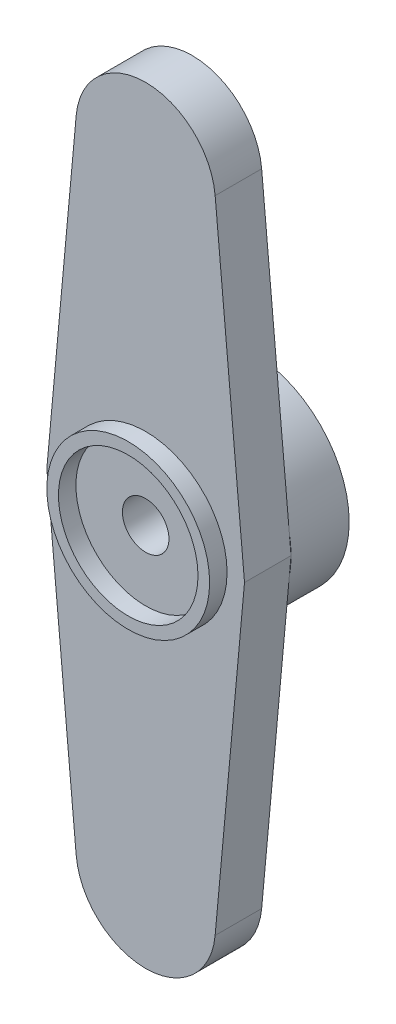
ISO-10303-21;
HEADER;
FILE_DESCRIPTION(('STEP AP214'),'2;1');
FILE_NAME('part.step','',(''),(''),'','','');
FILE_SCHEMA(('AUTOMOTIVE_DESIGN { 1 0 10303 214 1 1 1 1 }'));
ENDSEC;
DATA;
#1=APPLICATION_CONTEXT('core data for automotive mechanical design processes');
#2=APPLICATION_PROTOCOL_DEFINITION('international standard','automotive_design',2000,#1);
#3=PRODUCT_CONTEXT('',#1,'mechanical');
#4=PRODUCT('Part','Part','',(#3));
#5=PRODUCT_RELATED_PRODUCT_CATEGORY('part','',(#4));
#6=PRODUCT_DEFINITION_FORMATION('','',#4);
#7=PRODUCT_DEFINITION_CONTEXT('part definition',#1,'design');
#8=PRODUCT_DEFINITION('design','',#6,#7);
#9=PRODUCT_DEFINITION_SHAPE('','',#8);
#10=(LENGTH_UNIT() NAMED_UNIT(*) SI_UNIT(.MILLI.,.METRE.));
#11=(NAMED_UNIT(*) PLANE_ANGLE_UNIT() SI_UNIT($,.RADIAN.));
#12=(NAMED_UNIT(*) SI_UNIT($,.STERADIAN.) SOLID_ANGLE_UNIT());
#13=UNCERTAINTY_MEASURE_WITH_UNIT(LENGTH_MEASURE(1.E-05),#10,'distance_accuracy_value','');
#14=(GEOMETRIC_REPRESENTATION_CONTEXT(3) GLOBAL_UNCERTAINTY_ASSIGNED_CONTEXT((#13)) GLOBAL_UNIT_ASSIGNED_CONTEXT((#10,
#11,#12)) REPRESENTATION_CONTEXT('',''));
#15=CARTESIAN_POINT('',(0.,0.,0.));
#16=DIRECTION('',(0.,0.,1.));
#17=DIRECTION('',(1.,0.,0.));
#18=AXIS2_PLACEMENT_3D('',#15,#16,#17);
#19=CARTESIAN_POINT('',(0.,-13.5,4.5));
#20=DIRECTION('',(0.,0.,1.));
#21=DIRECTION('',(1.,0.,0.));
#22=AXIS2_PLACEMENT_3D('',#19,#20,#21);
#23=PLANE('',#22);
#24=CARTESIAN_POINT('',(0.,0.,4.5));
#25=DIRECTION('',(0.,0.,1.));
#26=DIRECTION('',(1.,0.,0.));
#27=AXIS2_PLACEMENT_3D('',#24,#25,#26);
#28=CIRCLE('',#27,1.);
#29=CARTESIAN_POINT('',(1.,0.,4.5));
#30=VERTEX_POINT('',#29);
#31=EDGE_CURVE('E228',#30,#30,#28,.T.);
#32=ORIENTED_EDGE('',*,*,#31,.F.);
#33=EDGE_LOOP('',(#32));
#34=FACE_BOUND('',#33,.T.);
#35=CARTESIAN_POINT('',(0.,0.,4.5));
#36=DIRECTION('',(0.,0.,1.));
#37=DIRECTION('',(1.,0.,0.));
#38=AXIS2_PLACEMENT_3D('',#35,#36,#37);
#39=CIRCLE('',#38,3.);
#40=CARTESIAN_POINT('',(3.,0.,4.5));
#41=VERTEX_POINT('',#40);
#42=EDGE_CURVE('E425',#41,#41,#39,.T.);
#43=ORIENTED_EDGE('',*,*,#42,.T.);
#44=EDGE_LOOP('',(#43));
#45=FACE_BOUND('',#44,.T.);
#46=ADVANCED_FACE('F39',(#34,#45),#23,.T.);
#47=CARTESIAN_POINT('',(0.,0.,2.5));
#48=DIRECTION('',(0.,0.,1.));
#49=DIRECTION('',(1.,0.,0.));
#50=AXIS2_PLACEMENT_3D('',#47,#48,#49);
#51=PLANE('',#50);
#52=DIRECTION('',(0.0912783716587728,-0.995825415857279,0.));
#53=VECTOR('',#52,1.);
#54=CARTESIAN_POINT('',(-4.25,0.,2.5));
#55=LINE('',#54,#53);
#56=CARTESIAN_POINT('',(-4.25,0.,2.5));
#57=VERTEX_POINT('',#56);
#58=CARTESIAN_POINT('',(-4.17918020037224,-0.772627240534918,2.5));
#59=VERTEX_POINT('',#58);
#60=EDGE_CURVE('E246',#57,#59,#55,.T.);
#61=ORIENTED_EDGE('',*,*,#60,.F.);
#62=CARTESIAN_POINT('',(0.,0.,2.5));
#63=DIRECTION('',(0.,0.,1.));
#64=DIRECTION('',(1.,0.,0.));
#65=AXIS2_PLACEMENT_3D('',#62,#63,#64);
#66=CIRCLE('',#65,4.25);
#67=EDGE_CURVE('E154',#57,#59,#66,.T.);
#68=ORIENTED_EDGE('',*,*,#67,.T.);
#69=EDGE_LOOP('',(#61,#68));
#70=FACE_BOUND('',#69,.T.);
#71=ADVANCED_FACE('F181',(#70),#51,.T.);
#72=DIRECTION('',(-0.0912783716587731,-0.995825415857279,0.));
#73=VECTOR('',#72,1.);
#74=CARTESIAN_POINT('',(-4.25,0.,2.5));
#75=LINE('',#74,#73);
#76=CARTESIAN_POINT('',(-4.17918020037224,0.772627240534919,2.5));
#77=VERTEX_POINT('',#76);
#78=EDGE_CURVE('E48',#77,#57,#75,.T.);
#79=ORIENTED_EDGE('',*,*,#78,.F.);
#80=EDGE_CURVE('E152',#77,#57,#66,.T.);
#81=ORIENTED_EDGE('',*,*,#80,.T.);
#82=EDGE_LOOP('',(#79,#81));
#83=FACE_BOUND('',#82,.T.);
#84=ADVANCED_FACE('F188',(#83),#51,.T.);
#85=DIRECTION('',(-0.0912783716587731,0.995825415857279,0.));
#86=VECTOR('',#85,1.);
#87=CARTESIAN_POINT('',(2.98747624757184,13.7738351149763,2.5));
#88=LINE('',#87,#86);
#89=CARTESIAN_POINT('',(4.25,0.,2.5));
#90=VERTEX_POINT('',#89);
#91=CARTESIAN_POINT('',(4.17918020037224,0.772627240534919,2.5));
#92=VERTEX_POINT('',#91);
#93=EDGE_CURVE('E254',#90,#92,#88,.T.);
#94=ORIENTED_EDGE('',*,*,#93,.F.);
#95=EDGE_CURVE('E145',#90,#92,#66,.T.);
#96=ORIENTED_EDGE('',*,*,#95,.T.);
#97=EDGE_LOOP('',(#94,#96));
#98=FACE_BOUND('',#97,.T.);
#99=ADVANCED_FACE('F387',(#98),#51,.T.);
#100=DIRECTION('',(0.0912783716587728,0.995825415857279,0.));
#101=VECTOR('',#100,1.);
#102=CARTESIAN_POINT('',(2.98747624757184,-13.7738351149763,2.5));
#103=LINE('',#102,#101);
#104=CARTESIAN_POINT('',(4.17918020037224,-0.772627240534918,2.5));
#105=VERTEX_POINT('',#104);
#106=EDGE_CURVE('E54',#105,#90,#103,.T.);
#107=ORIENTED_EDGE('',*,*,#106,.F.);
#108=EDGE_CURVE('E150',#105,#90,#66,.T.);
#109=ORIENTED_EDGE('',*,*,#108,.T.);
#110=EDGE_LOOP('',(#107,#109));
#111=FACE_BOUND('',#110,.T.);
#112=ADVANCED_FACE('F162',(#111),#51,.T.);
#113=CARTESIAN_POINT('',(0.,0.,0.));
#114=DIRECTION('',(0.,0.,1.));
#115=DIRECTION('',(1.,0.,0.));
#116=AXIS2_PLACEMENT_3D('',#113,#114,#115);
#117=PLANE('',#116);
#118=CARTESIAN_POINT('',(0.,0.,0.));
#119=DIRECTION('',(0.,0.,1.));
#120=DIRECTION('',(1.,0.,0.));
#121=AXIS2_PLACEMENT_3D('',#118,#119,#120);
#122=CIRCLE('',#121,4.25);
#123=CARTESIAN_POINT('',(4.25,0.,0.));
#124=VERTEX_POINT('',#123);
#125=EDGE_CURVE('E43',#124,#124,#122,.T.);
#126=ORIENTED_EDGE('',*,*,#125,.F.);
#127=EDGE_LOOP('',(#126));
#128=FACE_BOUND('',#127,.T.);
#129=CARTESIAN_POINT('',(0.,0.,0.));
#130=DIRECTION('',(0.,0.,1.));
#131=DIRECTION('',(1.,0.,0.));
#132=AXIS2_PLACEMENT_3D('',#129,#130,#131);
#133=CIRCLE('',#132,2.5);
#134=CARTESIAN_POINT('',(2.5,0.,0.));
#135=VERTEX_POINT('',#134);
#136=EDGE_CURVE('E139',#135,#135,#133,.T.);
#137=ORIENTED_EDGE('',*,*,#136,.T.);
#138=EDGE_LOOP('',(#137));
#139=FACE_BOUND('',#138,.T.);
#140=ADVANCED_FACE('F159',(#128,#139),#117,.F.);
#141=CARTESIAN_POINT('',(0.,0.,2.5));
#142=DIRECTION('',(0.,0.,-1.));
#143=DIRECTION('',(-1.,0.,0.));
#144=AXIS2_PLACEMENT_3D('',#141,#142,#143);
#145=CYLINDRICAL_SURFACE('',#144,4.25);
#146=ORIENTED_EDGE('',*,*,#95,.F.);
#147=ORIENTED_EDGE('',*,*,#108,.F.);
#148=EDGE_CURVE('E65',#59,#105,#66,.T.);
#149=ORIENTED_EDGE('',*,*,#148,.F.);
#150=ORIENTED_EDGE('',*,*,#67,.F.);
#151=ORIENTED_EDGE('',*,*,#80,.F.);
#152=EDGE_CURVE('E148',#92,#77,#66,.T.);
#153=ORIENTED_EDGE('',*,*,#152,.F.);
#154=EDGE_LOOP('',(#146,#147,#149,#150,#151,#153));
#155=FACE_BOUND('',#154,.T.);
#156=ORIENTED_EDGE('',*,*,#125,.T.);
#157=EDGE_LOOP('',(#156));
#158=FACE_BOUND('',#157,.T.);
#159=ADVANCED_FACE('F41',(#155,#158),#145,.T.);
#160=CARTESIAN_POINT('',(0.,0.,2.5));
#161=DIRECTION('',(0.,0.,-1.));
#162=DIRECTION('',(-1.,0.,0.));
#163=AXIS2_PLACEMENT_3D('',#160,#161,#162);
#164=CYLINDRICAL_SURFACE('',#163,2.5);
#165=CARTESIAN_POINT('',(0.,0.,2.5));
#166=DIRECTION('',(0.,0.,1.));
#167=DIRECTION('',(1.,0.,0.));
#168=AXIS2_PLACEMENT_3D('',#165,#166,#167);
#169=CIRCLE('',#168,2.5);
#170=CARTESIAN_POINT('',(2.5,0.,2.5));
#171=VERTEX_POINT('',#170);
#172=EDGE_CURVE('E131',#171,#171,#169,.T.);
#173=ORIENTED_EDGE('',*,*,#172,.T.);
#174=EDGE_LOOP('',(#173));
#175=FACE_BOUND('',#174,.T.);
#176=ORIENTED_EDGE('',*,*,#136,.F.);
#177=EDGE_LOOP('',(#176));
#178=FACE_BOUND('',#177,.T.);
#179=ADVANCED_FACE('F167',(#175,#178),#164,.F.);
#180=CARTESIAN_POINT('',(0.,-13.5,2.5));
#181=DIRECTION('',(0.,0.,1.));
#182=DIRECTION('',(1.,0.,0.));
#183=AXIS2_PLACEMENT_3D('',#180,#181,#182);
#184=PLANE('',#183);
#185=CARTESIAN_POINT('',(2.98747624757184,13.7738351149763,2.5));
#186=VERTEX_POINT('',#185);
#187=EDGE_CURVE('E255',#92,#186,#88,.T.);
#188=ORIENTED_EDGE('',*,*,#187,.F.);
#189=ORIENTED_EDGE('',*,*,#152,.T.);
#190=CARTESIAN_POINT('',(-2.98747624757184,13.7738351149763,2.5));
#191=VERTEX_POINT('',#190);
#192=EDGE_CURVE('E130',#191,#77,#75,.T.);
#193=ORIENTED_EDGE('',*,*,#192,.F.);
#194=CARTESIAN_POINT('',(0.,13.5,2.5));
#195=DIRECTION('',(0.,0.,1.));
#196=DIRECTION('',(-1.,0.,0.));
#197=AXIS2_PLACEMENT_3D('',#194,#195,#196);
#198=CIRCLE('',#197,3.);
#199=EDGE_CURVE('E256',#186,#191,#198,.T.);
#200=ORIENTED_EDGE('',*,*,#199,.F.);
#201=EDGE_LOOP('',(#188,#189,#193,#200));
#202=FACE_BOUND('',#201,.T.);
#203=ADVANCED_FACE('F169',(#202),#184,.F.);
#204=CARTESIAN_POINT('',(-2.98747624757184,-13.7738351149763,2.5));
#205=VERTEX_POINT('',#204);
#206=EDGE_CURVE('E135',#59,#205,#55,.T.);
#207=ORIENTED_EDGE('',*,*,#206,.F.);
#208=ORIENTED_EDGE('',*,*,#148,.T.);
#209=CARTESIAN_POINT('',(2.98747624757184,-13.7738351149763,2.5));
#210=VERTEX_POINT('',#209);
#211=EDGE_CURVE('E155',#210,#105,#103,.T.);
#212=ORIENTED_EDGE('',*,*,#211,.F.);
#213=CARTESIAN_POINT('',(0.,-13.5,2.5));
#214=DIRECTION('',(0.,0.,1.));
#215=DIRECTION('',(1.,0.,0.));
#216=AXIS2_PLACEMENT_3D('',#213,#214,#215);
#217=CIRCLE('',#216,3.);
#218=EDGE_CURVE('E253',#205,#210,#217,.T.);
#219=ORIENTED_EDGE('',*,*,#218,.F.);
#220=EDGE_LOOP('',(#207,#208,#212,#219));
#221=FACE_BOUND('',#220,.T.);
#222=ADVANCED_FACE('F173',(#221),#184,.F.);
#223=CARTESIAN_POINT('',(0.,0.,4.5));
#224=DIRECTION('',(0.,0.,1.));
#225=DIRECTION('',(1.,0.,0.));
#226=AXIS2_PLACEMENT_3D('',#223,#224,#225);
#227=CIRCLE('',#226,3.5);
#228=CARTESIAN_POINT('',(3.5,0.,4.5));
#229=VERTEX_POINT('',#228);
#230=EDGE_CURVE('E11',#229,#229,#227,.T.);
#231=ORIENTED_EDGE('',*,*,#230,.F.);
#232=EDGE_LOOP('',(#231));
#233=FACE_BOUND('',#232,.T.);
#234=DIRECTION('',(0.0912783716587728,-0.995825415857279,0.));
#235=VECTOR('',#234,1.);
#236=CARTESIAN_POINT('',(-4.25,0.,4.5));
#237=LINE('',#236,#235);
#238=CARTESIAN_POINT('',(-4.25,0.,4.5));
#239=VERTEX_POINT('',#238);
#240=CARTESIAN_POINT('',(-2.98747624757184,-13.7738351149763,4.5));
#241=VERTEX_POINT('',#240);
#242=EDGE_CURVE('E119',#239,#241,#237,.T.);
#243=ORIENTED_EDGE('',*,*,#242,.T.);
#244=CARTESIAN_POINT('',(0.,-13.5,4.5));
#245=DIRECTION('',(0.,0.,1.));
#246=DIRECTION('',(1.,0.,0.));
#247=AXIS2_PLACEMENT_3D('',#244,#245,#246);
#248=CIRCLE('',#247,3.);
#249=CARTESIAN_POINT('',(2.98747624757184,-13.7738351149763,4.5));
#250=VERTEX_POINT('',#249);
#251=EDGE_CURVE('E107',#241,#250,#248,.T.);
#252=ORIENTED_EDGE('',*,*,#251,.T.);
#253=DIRECTION('',(0.0912783716587728,0.995825415857279,0.));
#254=VECTOR('',#253,1.);
#255=CARTESIAN_POINT('',(2.98747624757184,-13.7738351149763,4.5));
#256=LINE('',#255,#254);
#257=CARTESIAN_POINT('',(4.25,0.,4.5));
#258=VERTEX_POINT('',#257);
#259=EDGE_CURVE('E120',#250,#258,#256,.T.);
#260=ORIENTED_EDGE('',*,*,#259,.T.);
#261=DIRECTION('',(-0.0912783716587731,0.995825415857279,0.));
#262=VECTOR('',#261,1.);
#263=CARTESIAN_POINT('',(2.98747624757184,13.7738351149763,4.5));
#264=LINE('',#263,#262);
#265=CARTESIAN_POINT('',(2.98747624757184,13.7738351149763,4.5));
#266=VERTEX_POINT('',#265);
#267=EDGE_CURVE('E244',#258,#266,#264,.T.);
#268=ORIENTED_EDGE('',*,*,#267,.T.);
#269=CARTESIAN_POINT('',(0.,13.5,4.5));
#270=DIRECTION('',(0.,0.,1.));
#271=DIRECTION('',(-1.,0.,0.));
#272=AXIS2_PLACEMENT_3D('',#269,#270,#271);
#273=CIRCLE('',#272,3.);
#274=CARTESIAN_POINT('',(-2.98747624757184,13.7738351149763,4.5));
#275=VERTEX_POINT('',#274);
#276=EDGE_CURVE('E243',#266,#275,#273,.T.);
#277=ORIENTED_EDGE('',*,*,#276,.T.);
#278=DIRECTION('',(-0.0912783716587731,-0.995825415857279,0.));
#279=VECTOR('',#278,1.);
#280=CARTESIAN_POINT('',(-4.25,0.,4.5));
#281=LINE('',#280,#279);
#282=EDGE_CURVE('E125',#275,#239,#281,.T.);
#283=ORIENTED_EDGE('',*,*,#282,.T.);
#284=EDGE_LOOP('',(#243,#252,#260,#268,#277,#283));
#285=FACE_BOUND('',#284,.T.);
#286=ADVANCED_FACE('F122',(#233,#285),#23,.T.);
#287=ORIENTED_EDGE('',*,*,#172,.F.);
#288=EDGE_LOOP('',(#287));
#289=FACE_BOUND('',#288,.T.);
#290=CARTESIAN_POINT('',(0.,0.,2.5));
#291=DIRECTION('',(0.,0.,1.));
#292=DIRECTION('',(1.,0.,0.));
#293=AXIS2_PLACEMENT_3D('',#290,#291,#292);
#294=CIRCLE('',#293,1.);
#295=CARTESIAN_POINT('',(1.,0.,2.5));
#296=VERTEX_POINT('',#295);
#297=EDGE_CURVE('E235',#296,#296,#294,.T.);
#298=ORIENTED_EDGE('',*,*,#297,.T.);
#299=EDGE_LOOP('',(#298));
#300=FACE_BOUND('',#299,.T.);
#301=ADVANCED_FACE('F180',(#289,#300),#184,.F.);
#302=CARTESIAN_POINT('',(-4.25,0.,4.5));
#303=DIRECTION('',(0.995825415857279,0.0912783716587728,0.));
#304=DIRECTION('',(-0.0912783716587729,0.995825415857279,0.));
#305=AXIS2_PLACEMENT_3D('',#302,#303,#304);
#306=PLANE('',#305);
#307=ORIENTED_EDGE('',*,*,#60,.T.);
#308=ORIENTED_EDGE('',*,*,#206,.T.);
#309=DIRECTION('',(0.,0.,-1.));
#310=VECTOR('',#309,1.);
#311=CARTESIAN_POINT('',(-2.98747624757184,-13.7738351149763,4.5));
#312=LINE('',#311,#310);
#313=EDGE_CURVE('E115',#241,#205,#312,.T.);
#314=ORIENTED_EDGE('',*,*,#313,.F.);
#315=ORIENTED_EDGE('',*,*,#242,.F.);
#316=DIRECTION('',(0.,0.,-1.));
#317=VECTOR('',#316,1.);
#318=CARTESIAN_POINT('',(-4.25,0.,4.5));
#319=LINE('',#318,#317);
#320=EDGE_CURVE('E250',#239,#57,#319,.T.);
#321=ORIENTED_EDGE('',*,*,#320,.T.);
#322=EDGE_LOOP('',(#307,#308,#314,#315,#321));
#323=FACE_BOUND('',#322,.T.);
#324=ADVANCED_FACE('F128',(#323),#306,.F.);
#325=CARTESIAN_POINT('',(0.,-13.5,4.5));
#326=DIRECTION('',(0.,0.,-1.));
#327=DIRECTION('',(-1.,0.,0.));
#328=AXIS2_PLACEMENT_3D('',#325,#326,#327);
#329=CYLINDRICAL_SURFACE('',#328,3.);
#330=ORIENTED_EDGE('',*,*,#218,.T.);
#331=DIRECTION('',(0.,0.,-1.));
#332=VECTOR('',#331,1.);
#333=CARTESIAN_POINT('',(2.98747624757184,-13.7738351149763,4.5));
#334=LINE('',#333,#332);
#335=EDGE_CURVE('E111',#250,#210,#334,.T.);
#336=ORIENTED_EDGE('',*,*,#335,.F.);
#337=ORIENTED_EDGE('',*,*,#251,.F.);
#338=ORIENTED_EDGE('',*,*,#313,.T.);
#339=EDGE_LOOP('',(#330,#336,#337,#338));
#340=FACE_BOUND('',#339,.T.);
#341=ADVANCED_FACE('F109',(#340),#329,.T.);
#342=CARTESIAN_POINT('',(2.98747624757184,-13.7738351149763,4.5));
#343=DIRECTION('',(-0.995825415857279,0.0912783716587728,0.));
#344=DIRECTION('',(-0.0912783716587729,-0.995825415857279,0.));
#345=AXIS2_PLACEMENT_3D('',#342,#343,#344);
#346=PLANE('',#345);
#347=ORIENTED_EDGE('',*,*,#211,.T.);
#348=ORIENTED_EDGE('',*,*,#106,.T.);
#349=DIRECTION('',(0.,0.,-1.));
#350=VECTOR('',#349,1.);
#351=CARTESIAN_POINT('',(4.25,0.,4.5));
#352=LINE('',#351,#350);
#353=EDGE_CURVE('E136',#258,#90,#352,.T.);
#354=ORIENTED_EDGE('',*,*,#353,.F.);
#355=ORIENTED_EDGE('',*,*,#259,.F.);
#356=ORIENTED_EDGE('',*,*,#335,.T.);
#357=EDGE_LOOP('',(#347,#348,#354,#355,#356));
#358=FACE_BOUND('',#357,.T.);
#359=ADVANCED_FACE('F274',(#358),#346,.F.);
#360=CARTESIAN_POINT('',(2.98747624757184,13.7738351149763,4.5));
#361=DIRECTION('',(-0.995825415857279,-0.0912783716587731,0.));
#362=DIRECTION('',(0.0912783716587731,-0.995825415857279,0.));
#363=AXIS2_PLACEMENT_3D('',#360,#361,#362);
#364=PLANE('',#363);
#365=ORIENTED_EDGE('',*,*,#93,.T.);
#366=ORIENTED_EDGE('',*,*,#187,.T.);
#367=DIRECTION('',(0.,0.,-1.));
#368=VECTOR('',#367,1.);
#369=CARTESIAN_POINT('',(2.98747624757184,13.7738351149763,4.5));
#370=LINE('',#369,#368);
#371=EDGE_CURVE('E266',#266,#186,#370,.T.);
#372=ORIENTED_EDGE('',*,*,#371,.F.);
#373=ORIENTED_EDGE('',*,*,#267,.F.);
#374=ORIENTED_EDGE('',*,*,#353,.T.);
#375=EDGE_LOOP('',(#365,#366,#372,#373,#374));
#376=FACE_BOUND('',#375,.T.);
#377=ADVANCED_FACE('F275',(#376),#364,.F.);
#378=CARTESIAN_POINT('',(0.,13.5,4.5));
#379=DIRECTION('',(0.,0.,-1.));
#380=DIRECTION('',(-1.,0.,0.));
#381=AXIS2_PLACEMENT_3D('',#378,#379,#380);
#382=CYLINDRICAL_SURFACE('',#381,3.);
#383=ORIENTED_EDGE('',*,*,#199,.T.);
#384=DIRECTION('',(0.,0.,-1.));
#385=VECTOR('',#384,1.);
#386=CARTESIAN_POINT('',(-2.98747624757184,13.7738351149763,4.5));
#387=LINE('',#386,#385);
#388=EDGE_CURVE('E263',#275,#191,#387,.T.);
#389=ORIENTED_EDGE('',*,*,#388,.F.);
#390=ORIENTED_EDGE('',*,*,#276,.F.);
#391=ORIENTED_EDGE('',*,*,#371,.T.);
#392=EDGE_LOOP('',(#383,#389,#390,#391));
#393=FACE_BOUND('',#392,.T.);
#394=ADVANCED_FACE('F223',(#393),#382,.T.);
#395=CARTESIAN_POINT('',(-4.25,0.,4.5));
#396=DIRECTION('',(0.995825415857279,-0.0912783716587731,0.));
#397=DIRECTION('',(0.0912783716587731,0.995825415857279,0.));
#398=AXIS2_PLACEMENT_3D('',#395,#396,#397);
#399=PLANE('',#398);
#400=ORIENTED_EDGE('',*,*,#192,.T.);
#401=ORIENTED_EDGE('',*,*,#78,.T.);
#402=ORIENTED_EDGE('',*,*,#320,.F.);
#403=ORIENTED_EDGE('',*,*,#282,.F.);
#404=ORIENTED_EDGE('',*,*,#388,.T.);
#405=EDGE_LOOP('',(#400,#401,#402,#403,#404));
#406=FACE_BOUND('',#405,.T.);
#407=ADVANCED_FACE('F219',(#406),#399,.F.);
#408=CARTESIAN_POINT('',(0.,0.,4.5));
#409=DIRECTION('',(0.,0.,-1.));
#410=DIRECTION('',(-1.,0.,0.));
#411=AXIS2_PLACEMENT_3D('',#408,#409,#410);
#412=CYLINDRICAL_SURFACE('',#411,1.);
#413=ORIENTED_EDGE('',*,*,#31,.T.);
#414=EDGE_LOOP('',(#413));
#415=FACE_BOUND('',#414,.T.);
#416=ORIENTED_EDGE('',*,*,#297,.F.);
#417=EDGE_LOOP('',(#416));
#418=FACE_BOUND('',#417,.T.);
#419=ADVANCED_FACE('F216',(#415,#418),#412,.F.);
#420=CARTESIAN_POINT('',(0.,0.,5.25));
#421=DIRECTION('',(0.,0.,1.));
#422=DIRECTION('',(1.,0.,0.));
#423=AXIS2_PLACEMENT_3D('',#420,#421,#422);
#424=PLANE('',#423);
#425=CARTESIAN_POINT('',(0.,0.,5.25));
#426=DIRECTION('',(0.,0.,1.));
#427=DIRECTION('',(1.,0.,0.));
#428=AXIS2_PLACEMENT_3D('',#425,#426,#427);
#429=CIRCLE('',#428,3.5);
#430=CARTESIAN_POINT('',(3.5,0.,5.25));
#431=VERTEX_POINT('',#430);
#432=EDGE_CURVE('E233',#431,#431,#429,.T.);
#433=ORIENTED_EDGE('',*,*,#432,.T.);
#434=EDGE_LOOP('',(#433));
#435=FACE_BOUND('',#434,.T.);
#436=CARTESIAN_POINT('',(0.,0.,5.25));
#437=DIRECTION('',(0.,0.,1.));
#438=DIRECTION('',(1.,0.,0.));
#439=AXIS2_PLACEMENT_3D('',#436,#437,#438);
#440=CIRCLE('',#439,3.);
#441=CARTESIAN_POINT('',(3.,0.,5.25));
#442=VERTEX_POINT('',#441);
#443=EDGE_CURVE('E239',#442,#442,#440,.T.);
#444=ORIENTED_EDGE('',*,*,#443,.F.);
#445=EDGE_LOOP('',(#444));
#446=FACE_BOUND('',#445,.T.);
#447=ADVANCED_FACE('F208',(#435,#446),#424,.T.);
#448=CARTESIAN_POINT('',(0.,0.,5.25));
#449=DIRECTION('',(0.,0.,-1.));
#450=DIRECTION('',(-1.,0.,0.));
#451=AXIS2_PLACEMENT_3D('',#448,#449,#450);
#452=CYLINDRICAL_SURFACE('',#451,3.5);
#453=ORIENTED_EDGE('',*,*,#432,.F.);
#454=EDGE_LOOP('',(#453));
#455=FACE_BOUND('',#454,.T.);
#456=ORIENTED_EDGE('',*,*,#230,.T.);
#457=EDGE_LOOP('',(#456));
#458=FACE_BOUND('',#457,.T.);
#459=ADVANCED_FACE('F202',(#455,#458),#452,.T.);
#460=CARTESIAN_POINT('',(0.,0.,5.25));
#461=DIRECTION('',(0.,0.,-1.));
#462=DIRECTION('',(-1.,0.,0.));
#463=AXIS2_PLACEMENT_3D('',#460,#461,#462);
#464=CYLINDRICAL_SURFACE('',#463,3.);
#465=ORIENTED_EDGE('',*,*,#443,.T.);
#466=EDGE_LOOP('',(#465));
#467=FACE_BOUND('',#466,.T.);
#468=ORIENTED_EDGE('',*,*,#42,.F.);
#469=EDGE_LOOP('',(#468));
#470=FACE_BOUND('',#469,.T.);
#471=ADVANCED_FACE('F210',(#467,#470),#464,.F.);
#472=CLOSED_SHELL('',(#46,#71,#84,#99,#112,#140,#159,#179,#203,#222,#286,#301,#324,#341,#359,
#377,#394,#407,#419,#447,#459,#471));
#473=MANIFOLD_SOLID_BREP('B2',#472);
#474=ADVANCED_BREP_SHAPE_REPRESENTATION('',(#18,#473),#14);
#475=SHAPE_DEFINITION_REPRESENTATION(#9,#474);
ENDSEC;
END-ISO-10303-21;
